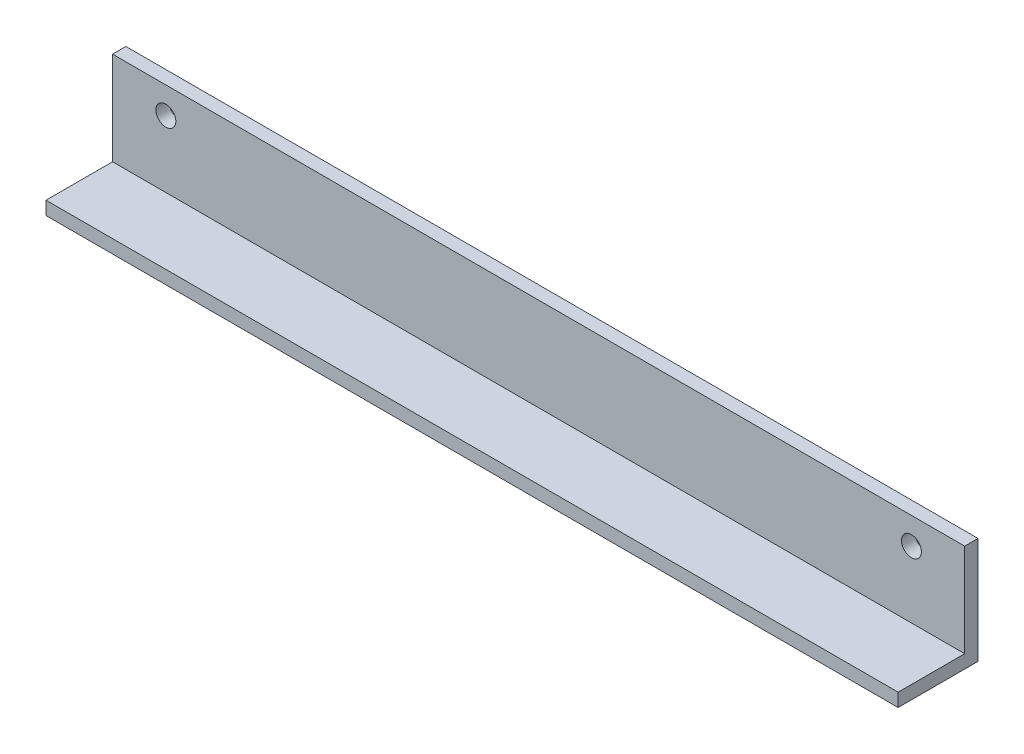
ISO-10303-21;
HEADER;
FILE_DESCRIPTION(('STEP AP214'),'2;1');
FILE_NAME('part.step','',(''),(''),'','','');
FILE_SCHEMA(('AUTOMOTIVE_DESIGN { 1 0 10303 214 1 1 1 1 }'));
ENDSEC;
DATA;
#1=APPLICATION_CONTEXT('core data for automotive mechanical design processes');
#2=APPLICATION_PROTOCOL_DEFINITION('international standard','automotive_design',2000,#1);
#3=PRODUCT_CONTEXT('',#1,'mechanical');
#4=PRODUCT('Part','Part','',(#3));
#5=PRODUCT_RELATED_PRODUCT_CATEGORY('part','',(#4));
#6=PRODUCT_DEFINITION_FORMATION('','',#4);
#7=PRODUCT_DEFINITION_CONTEXT('part definition',#1,'design');
#8=PRODUCT_DEFINITION('design','',#6,#7);
#9=PRODUCT_DEFINITION_SHAPE('','',#8);
#10=(LENGTH_UNIT() NAMED_UNIT(*) SI_UNIT(.MILLI.,.METRE.));
#11=(NAMED_UNIT(*) PLANE_ANGLE_UNIT() SI_UNIT($,.RADIAN.));
#12=(NAMED_UNIT(*) SI_UNIT($,.STERADIAN.) SOLID_ANGLE_UNIT());
#13=UNCERTAINTY_MEASURE_WITH_UNIT(LENGTH_MEASURE(1.E-05),#10,'distance_accuracy_value','');
#14=(GEOMETRIC_REPRESENTATION_CONTEXT(3) GLOBAL_UNCERTAINTY_ASSIGNED_CONTEXT((#13)) GLOBAL_UNIT_ASSIGNED_CONTEXT((#10,
#11,#12)) REPRESENTATION_CONTEXT('',''));
#15=CARTESIAN_POINT('',(0.,0.,0.));
#16=DIRECTION('',(0.,0.,1.));
#17=DIRECTION('',(1.,0.,0.));
#18=AXIS2_PLACEMENT_3D('',#15,#16,#17);
#19=CARTESIAN_POINT('',(203.2,0.,0.));
#20=DIRECTION('',(0.,0.,1.));
#21=DIRECTION('',(1.,0.,0.));
#22=AXIS2_PLACEMENT_3D('',#19,#20,#21);
#23=PLANE('',#22);
#24=CARTESIAN_POINT('',(-177.8,38.1,0.));
#25=DIRECTION('',(0.,0.,1.));
#26=DIRECTION('',(1.,0.,0.));
#27=AXIS2_PLACEMENT_3D('',#24,#25,#26);
#28=CIRCLE('',#27,4.7625);
#29=CARTESIAN_POINT('',(-173.0375,38.1,0.));
#30=VERTEX_POINT('',#29);
#31=EDGE_CURVE('E161',#30,#30,#28,.T.);
#32=ORIENTED_EDGE('',*,*,#31,.T.);
#33=EDGE_LOOP('',(#32));
#34=FACE_BOUND('',#33,.T.);
#35=CARTESIAN_POINT('',(177.8,38.1,0.));
#36=DIRECTION('',(0.,0.,1.));
#37=DIRECTION('',(1.,0.,0.));
#38=AXIS2_PLACEMENT_3D('',#35,#36,#37);
#39=CIRCLE('',#38,4.7625);
#40=CARTESIAN_POINT('',(182.5625,38.1,0.));
#41=VERTEX_POINT('',#40);
#42=EDGE_CURVE('E120',#41,#41,#39,.T.);
#43=ORIENTED_EDGE('',*,*,#42,.T.);
#44=EDGE_LOOP('',(#43));
#45=FACE_BOUND('',#44,.T.);
#46=DIRECTION('',(0.,1.,0.));
#47=VECTOR('',#46,1.);
#48=CARTESIAN_POINT('',(-203.2,0.,0.));
#49=LINE('',#48,#47);
#50=CARTESIAN_POINT('',(-203.2,0.,0.));
#51=VERTEX_POINT('',#50);
#52=CARTESIAN_POINT('',(-203.2,50.8,0.));
#53=VERTEX_POINT('',#52);
#54=EDGE_CURVE('E116',#51,#53,#49,.T.);
#55=ORIENTED_EDGE('',*,*,#54,.T.);
#56=DIRECTION('',(-1.,0.,0.));
#57=VECTOR('',#56,1.);
#58=CARTESIAN_POINT('',(203.2,50.8,0.));
#59=LINE('',#58,#57);
#60=CARTESIAN_POINT('',(203.2,50.8,0.));
#61=VERTEX_POINT('',#60);
#62=EDGE_CURVE('E11',#61,#53,#59,.T.);
#63=ORIENTED_EDGE('',*,*,#62,.F.);
#64=DIRECTION('',(0.,1.,0.));
#65=VECTOR('',#64,1.);
#66=CARTESIAN_POINT('',(203.2,0.,0.));
#67=LINE('',#66,#65);
#68=CARTESIAN_POINT('',(203.2,0.,0.));
#69=VERTEX_POINT('',#68);
#70=EDGE_CURVE('E81',#69,#61,#67,.T.);
#71=ORIENTED_EDGE('',*,*,#70,.F.);
#72=DIRECTION('',(-1.,0.,0.));
#73=VECTOR('',#72,1.);
#74=CARTESIAN_POINT('',(203.2,0.,0.));
#75=LINE('',#74,#73);
#76=EDGE_CURVE('E112',#69,#51,#75,.T.);
#77=ORIENTED_EDGE('',*,*,#76,.T.);
#78=EDGE_LOOP('',(#55,#63,#71,#77));
#79=FACE_BOUND('',#78,.T.);
#80=ADVANCED_FACE('F35',(#34,#45,#79),#23,.F.);
#81=CARTESIAN_POINT('',(203.2,50.8,6.35));
#82=DIRECTION('',(0.,1.,0.));
#83=DIRECTION('',(0.,0.,1.));
#84=AXIS2_PLACEMENT_3D('',#81,#82,#83);
#85=PLANE('',#84);
#86=DIRECTION('',(0.,0.,-1.));
#87=VECTOR('',#86,1.);
#88=CARTESIAN_POINT('',(-203.2,50.8,6.35));
#89=LINE('',#88,#87);
#90=CARTESIAN_POINT('',(-203.2,50.8,6.35));
#91=VERTEX_POINT('',#90);
#92=EDGE_CURVE('E119',#91,#53,#89,.T.);
#93=ORIENTED_EDGE('',*,*,#92,.F.);
#94=DIRECTION('',(-1.,0.,0.));
#95=VECTOR('',#94,1.);
#96=CARTESIAN_POINT('',(203.2,50.8,6.35));
#97=LINE('',#96,#95);
#98=CARTESIAN_POINT('',(203.2,50.8,6.35));
#99=VERTEX_POINT('',#98);
#100=EDGE_CURVE('E43',#99,#91,#97,.T.);
#101=ORIENTED_EDGE('',*,*,#100,.F.);
#102=DIRECTION('',(0.,0.,-1.));
#103=VECTOR('',#102,1.);
#104=CARTESIAN_POINT('',(203.2,50.8,6.35));
#105=LINE('',#104,#103);
#106=EDGE_CURVE('E172',#99,#61,#105,.T.);
#107=ORIENTED_EDGE('',*,*,#106,.T.);
#108=ORIENTED_EDGE('',*,*,#62,.T.);
#109=EDGE_LOOP('',(#93,#101,#107,#108));
#110=FACE_BOUND('',#109,.T.);
#111=ADVANCED_FACE('F138',(#110),#85,.T.);
#112=CARTESIAN_POINT('',(203.2,0.,6.35));
#113=DIRECTION('',(0.,0.,1.));
#114=DIRECTION('',(1.,0.,0.));
#115=AXIS2_PLACEMENT_3D('',#112,#113,#114);
#116=PLANE('',#115);
#117=CARTESIAN_POINT('',(-177.8,38.1,6.35));
#118=DIRECTION('',(0.,0.,1.));
#119=DIRECTION('',(1.,0.,0.));
#120=AXIS2_PLACEMENT_3D('',#117,#118,#119);
#121=CIRCLE('',#120,4.7625);
#122=CARTESIAN_POINT('',(-173.0375,38.1,6.35));
#123=VERTEX_POINT('',#122);
#124=EDGE_CURVE('E174',#123,#123,#121,.T.);
#125=ORIENTED_EDGE('',*,*,#124,.F.);
#126=EDGE_LOOP('',(#125));
#127=FACE_BOUND('',#126,.T.);
#128=CARTESIAN_POINT('',(177.8,38.1,6.35));
#129=DIRECTION('',(0.,0.,1.));
#130=DIRECTION('',(1.,0.,0.));
#131=AXIS2_PLACEMENT_3D('',#128,#129,#130);
#132=CIRCLE('',#131,4.7625);
#133=CARTESIAN_POINT('',(182.5625,38.1,6.35));
#134=VERTEX_POINT('',#133);
#135=EDGE_CURVE('E165',#134,#134,#132,.T.);
#136=ORIENTED_EDGE('',*,*,#135,.F.);
#137=EDGE_LOOP('',(#136));
#138=FACE_BOUND('',#137,.T.);
#139=DIRECTION('',(0.,1.,0.));
#140=VECTOR('',#139,1.);
#141=CARTESIAN_POINT('',(-203.2,0.,6.35));
#142=LINE('',#141,#140);
#143=CARTESIAN_POINT('',(-203.2,6.35,6.35));
#144=VERTEX_POINT('',#143);
#145=EDGE_CURVE('E123',#144,#91,#142,.T.);
#146=ORIENTED_EDGE('',*,*,#145,.F.);
#147=DIRECTION('',(-1.,0.,0.));
#148=VECTOR('',#147,1.);
#149=CARTESIAN_POINT('',(203.2,6.35,6.35));
#150=LINE('',#149,#148);
#151=CARTESIAN_POINT('',(203.2,6.35,6.35));
#152=VERTEX_POINT('',#151);
#153=EDGE_CURVE('E102',#152,#144,#150,.T.);
#154=ORIENTED_EDGE('',*,*,#153,.F.);
#155=DIRECTION('',(0.,1.,0.));
#156=VECTOR('',#155,1.);
#157=CARTESIAN_POINT('',(203.2,0.,6.35));
#158=LINE('',#157,#156);
#159=EDGE_CURVE('E108',#152,#99,#158,.T.);
#160=ORIENTED_EDGE('',*,*,#159,.T.);
#161=ORIENTED_EDGE('',*,*,#100,.T.);
#162=EDGE_LOOP('',(#146,#154,#160,#161));
#163=FACE_BOUND('',#162,.T.);
#164=ADVANCED_FACE('F135',(#127,#138,#163),#116,.T.);
#165=CARTESIAN_POINT('',(203.2,6.35,38.1));
#166=DIRECTION('',(0.,1.,0.));
#167=DIRECTION('',(0.,0.,1.));
#168=AXIS2_PLACEMENT_3D('',#165,#166,#167);
#169=PLANE('',#168);
#170=DIRECTION('',(0.,0.,-1.));
#171=VECTOR('',#170,1.);
#172=CARTESIAN_POINT('',(-203.2,6.35,38.1));
#173=LINE('',#172,#171);
#174=CARTESIAN_POINT('',(-203.2,6.35,38.1));
#175=VERTEX_POINT('',#174);
#176=EDGE_CURVE('E97',#175,#144,#173,.T.);
#177=ORIENTED_EDGE('',*,*,#176,.F.);
#178=DIRECTION('',(-1.,0.,0.));
#179=VECTOR('',#178,1.);
#180=CARTESIAN_POINT('',(203.2,6.35,38.1));
#181=LINE('',#180,#179);
#182=CARTESIAN_POINT('',(203.2,6.35,38.1));
#183=VERTEX_POINT('',#182);
#184=EDGE_CURVE('E92',#183,#175,#181,.T.);
#185=ORIENTED_EDGE('',*,*,#184,.F.);
#186=DIRECTION('',(0.,0.,-1.));
#187=VECTOR('',#186,1.);
#188=CARTESIAN_POINT('',(203.2,6.35,38.1));
#189=LINE('',#188,#187);
#190=EDGE_CURVE('E95',#183,#152,#189,.T.);
#191=ORIENTED_EDGE('',*,*,#190,.T.);
#192=ORIENTED_EDGE('',*,*,#153,.T.);
#193=EDGE_LOOP('',(#177,#185,#191,#192));
#194=FACE_BOUND('',#193,.T.);
#195=ADVANCED_FACE('F94',(#194),#169,.T.);
#196=CARTESIAN_POINT('',(203.2,0.,38.1));
#197=DIRECTION('',(0.,0.,1.));
#198=DIRECTION('',(1.,0.,0.));
#199=AXIS2_PLACEMENT_3D('',#196,#197,#198);
#200=PLANE('',#199);
#201=DIRECTION('',(0.,1.,0.));
#202=VECTOR('',#201,1.);
#203=CARTESIAN_POINT('',(-203.2,0.,38.1));
#204=LINE('',#203,#202);
#205=CARTESIAN_POINT('',(-203.2,0.,38.1));
#206=VERTEX_POINT('',#205);
#207=EDGE_CURVE('E127',#206,#175,#204,.T.);
#208=ORIENTED_EDGE('',*,*,#207,.F.);
#209=DIRECTION('',(-1.,0.,0.));
#210=VECTOR('',#209,1.);
#211=CARTESIAN_POINT('',(203.2,0.,38.1));
#212=LINE('',#211,#210);
#213=CARTESIAN_POINT('',(203.2,0.,38.1));
#214=VERTEX_POINT('',#213);
#215=EDGE_CURVE('E72',#214,#206,#212,.T.);
#216=ORIENTED_EDGE('',*,*,#215,.F.);
#217=DIRECTION('',(0.,1.,0.));
#218=VECTOR('',#217,1.);
#219=CARTESIAN_POINT('',(203.2,0.,38.1));
#220=LINE('',#219,#218);
#221=EDGE_CURVE('E106',#214,#183,#220,.T.);
#222=ORIENTED_EDGE('',*,*,#221,.T.);
#223=ORIENTED_EDGE('',*,*,#184,.T.);
#224=EDGE_LOOP('',(#208,#216,#222,#223));
#225=FACE_BOUND('',#224,.T.);
#226=ADVANCED_FACE('F110',(#225),#200,.T.);
#227=CARTESIAN_POINT('',(203.2,0.,38.1));
#228=DIRECTION('',(0.,1.,0.));
#229=DIRECTION('',(0.,0.,1.));
#230=AXIS2_PLACEMENT_3D('',#227,#228,#229);
#231=PLANE('',#230);
#232=DIRECTION('',(0.,0.,-1.));
#233=VECTOR('',#232,1.);
#234=CARTESIAN_POINT('',(-203.2,0.,38.1));
#235=LINE('',#234,#233);
#236=EDGE_CURVE('E75',#206,#51,#235,.T.);
#237=ORIENTED_EDGE('',*,*,#236,.T.);
#238=ORIENTED_EDGE('',*,*,#76,.F.);
#239=DIRECTION('',(0.,0.,-1.));
#240=VECTOR('',#239,1.);
#241=CARTESIAN_POINT('',(203.2,0.,38.1));
#242=LINE('',#241,#240);
#243=EDGE_CURVE('E51',#214,#69,#242,.T.);
#244=ORIENTED_EDGE('',*,*,#243,.F.);
#245=ORIENTED_EDGE('',*,*,#215,.T.);
#246=EDGE_LOOP('',(#237,#238,#244,#245));
#247=FACE_BOUND('',#246,.T.);
#248=ADVANCED_FACE('F143',(#247),#231,.F.);
#249=CARTESIAN_POINT('',(203.2,0.,0.));
#250=DIRECTION('',(-1.,0.,0.));
#251=DIRECTION('',(0.,0.,1.));
#252=AXIS2_PLACEMENT_3D('',#249,#250,#251);
#253=PLANE('',#252);
#254=ORIENTED_EDGE('',*,*,#70,.T.);
#255=ORIENTED_EDGE('',*,*,#106,.F.);
#256=ORIENTED_EDGE('',*,*,#159,.F.);
#257=ORIENTED_EDGE('',*,*,#190,.F.);
#258=ORIENTED_EDGE('',*,*,#221,.F.);
#259=ORIENTED_EDGE('',*,*,#243,.T.);
#260=EDGE_LOOP('',(#254,#255,#256,#257,#258,#259));
#261=FACE_BOUND('',#260,.T.);
#262=ADVANCED_FACE('F105',(#261),#253,.F.);
#263=CARTESIAN_POINT('',(-203.2,0.,0.));
#264=DIRECTION('',(-1.,0.,0.));
#265=DIRECTION('',(0.,0.,1.));
#266=AXIS2_PLACEMENT_3D('',#263,#264,#265);
#267=PLANE('',#266);
#268=ORIENTED_EDGE('',*,*,#54,.F.);
#269=ORIENTED_EDGE('',*,*,#236,.F.);
#270=ORIENTED_EDGE('',*,*,#207,.T.);
#271=ORIENTED_EDGE('',*,*,#176,.T.);
#272=ORIENTED_EDGE('',*,*,#145,.T.);
#273=ORIENTED_EDGE('',*,*,#92,.T.);
#274=EDGE_LOOP('',(#268,#269,#270,#271,#272,#273));
#275=FACE_BOUND('',#274,.T.);
#276=ADVANCED_FACE('F141',(#275),#267,.T.);
#277=CARTESIAN_POINT('',(177.8,38.1,6.35));
#278=DIRECTION('',(0.,0.,1.));
#279=DIRECTION('',(1.,0.,0.));
#280=AXIS2_PLACEMENT_3D('',#277,#278,#279);
#281=CYLINDRICAL_SURFACE('',#280,4.7625);
#282=ORIENTED_EDGE('',*,*,#42,.F.);
#283=EDGE_LOOP('',(#282));
#284=FACE_BOUND('',#283,.T.);
#285=ORIENTED_EDGE('',*,*,#135,.T.);
#286=EDGE_LOOP('',(#285));
#287=FACE_BOUND('',#286,.T.);
#288=ADVANCED_FACE('F185',(#284,#287),#281,.F.);
#289=CARTESIAN_POINT('',(-177.8,38.1,6.35));
#290=DIRECTION('',(0.,0.,1.));
#291=DIRECTION('',(1.,0.,0.));
#292=AXIS2_PLACEMENT_3D('',#289,#290,#291);
#293=CYLINDRICAL_SURFACE('',#292,4.7625);
#294=ORIENTED_EDGE('',*,*,#31,.F.);
#295=EDGE_LOOP('',(#294));
#296=FACE_BOUND('',#295,.T.);
#297=ORIENTED_EDGE('',*,*,#124,.T.);
#298=EDGE_LOOP('',(#297));
#299=FACE_BOUND('',#298,.T.);
#300=ADVANCED_FACE('F178',(#296,#299),#293,.F.);
#301=CLOSED_SHELL('',(#80,#111,#164,#195,#226,#248,#262,#276,#288,#300));
#302=MANIFOLD_SOLID_BREP('B2',#301);
#303=ADVANCED_BREP_SHAPE_REPRESENTATION('',(#18,#302),#14);
#304=SHAPE_DEFINITION_REPRESENTATION(#9,#303);
ENDSEC;
END-ISO-10303-21;
